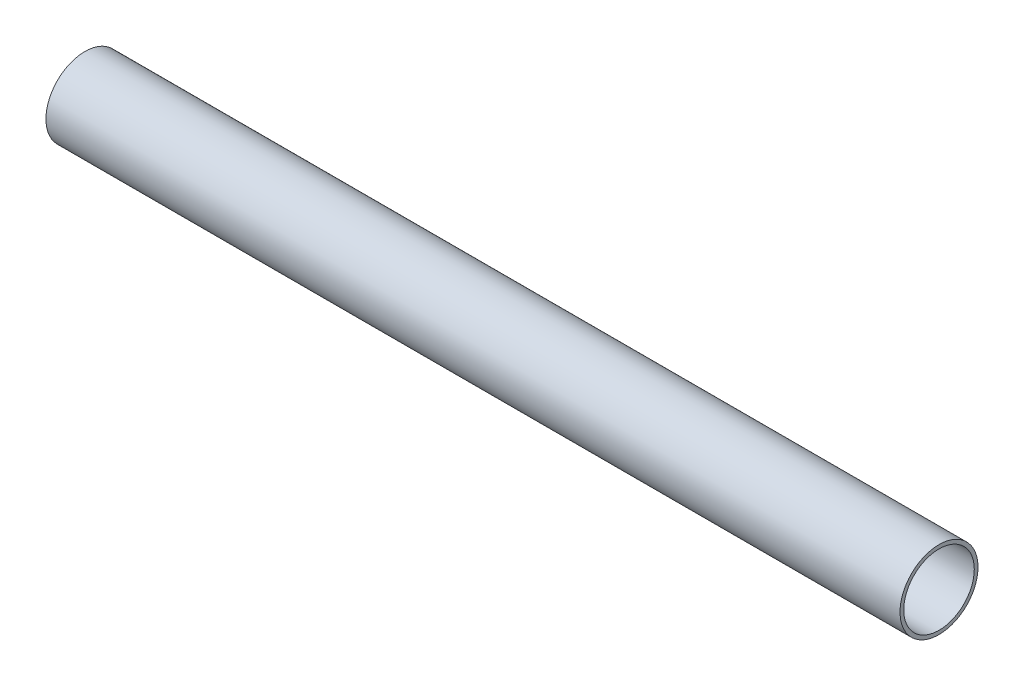
ISO-10303-21;
HEADER;
FILE_DESCRIPTION(('STEP AP214'),'2;1');
FILE_NAME('part.step','',(''),(''),'','','');
FILE_SCHEMA(('AUTOMOTIVE_DESIGN { 1 0 10303 214 1 1 1 1 }'));
ENDSEC;
DATA;
#1=APPLICATION_CONTEXT('core data for automotive mechanical design processes');
#2=APPLICATION_PROTOCOL_DEFINITION('international standard','automotive_design',2000,#1);
#3=PRODUCT_CONTEXT('',#1,'mechanical');
#4=PRODUCT('Part','Part','',(#3));
#5=PRODUCT_RELATED_PRODUCT_CATEGORY('part','',(#4));
#6=PRODUCT_DEFINITION_FORMATION('','',#4);
#7=PRODUCT_DEFINITION_CONTEXT('part definition',#1,'design');
#8=PRODUCT_DEFINITION('design','',#6,#7);
#9=PRODUCT_DEFINITION_SHAPE('','',#8);
#10=(LENGTH_UNIT() NAMED_UNIT(*) SI_UNIT(.MILLI.,.METRE.));
#11=(NAMED_UNIT(*) PLANE_ANGLE_UNIT() SI_UNIT($,.RADIAN.));
#12=(NAMED_UNIT(*) SI_UNIT($,.STERADIAN.) SOLID_ANGLE_UNIT());
#13=UNCERTAINTY_MEASURE_WITH_UNIT(LENGTH_MEASURE(1.E-05),#10,'distance_accuracy_value','');
#14=(GEOMETRIC_REPRESENTATION_CONTEXT(3) GLOBAL_UNCERTAINTY_ASSIGNED_CONTEXT((#13)) GLOBAL_UNIT_ASSIGNED_CONTEXT((#10,
#11,#12)) REPRESENTATION_CONTEXT('',''));
#15=CARTESIAN_POINT('',(0.,0.,0.));
#16=DIRECTION('',(0.,0.,1.));
#17=DIRECTION('',(1.,0.,0.));
#18=AXIS2_PLACEMENT_3D('',#15,#16,#17);
#19=CARTESIAN_POINT('',(230.,0.,0.));
#20=DIRECTION('',(1.,0.,0.));
#21=DIRECTION('',(0.,0.,-1.));
#22=AXIS2_PLACEMENT_3D('',#19,#20,#21);
#23=PLANE('',#22);
#24=CARTESIAN_POINT('',(230.,0.,0.));
#25=DIRECTION('',(1.,0.,0.));
#26=DIRECTION('',(0.,0.,-1.));
#27=AXIS2_PLACEMENT_3D('',#24,#25,#26);
#28=CIRCLE('',#27,10.5);
#29=CARTESIAN_POINT('',(230.,0.,-10.5));
#30=VERTEX_POINT('',#29);
#31=EDGE_CURVE('E10',#30,#30,#28,.T.);
#32=ORIENTED_EDGE('',*,*,#31,.T.);
#33=EDGE_LOOP('',(#32));
#34=FACE_BOUND('',#33,.T.);
#35=CARTESIAN_POINT('',(230.,0.,0.));
#36=DIRECTION('',(1.,0.,0.));
#37=DIRECTION('',(0.,0.,-1.));
#38=AXIS2_PLACEMENT_3D('',#35,#36,#37);
#39=CIRCLE('',#38,9.5);
#40=CARTESIAN_POINT('',(230.,0.,-9.5));
#41=VERTEX_POINT('',#40);
#42=EDGE_CURVE('E41',#41,#41,#39,.T.);
#43=ORIENTED_EDGE('',*,*,#42,.F.);
#44=EDGE_LOOP('',(#43));
#45=FACE_BOUND('',#44,.T.);
#46=ADVANCED_FACE('F30',(#34,#45),#23,.T.);
#47=CARTESIAN_POINT('',(0.,0.,0.));
#48=DIRECTION('',(1.,0.,0.));
#49=DIRECTION('',(0.,0.,-1.));
#50=AXIS2_PLACEMENT_3D('',#47,#48,#49);
#51=PLANE('',#50);
#52=CARTESIAN_POINT('',(0.,0.,0.));
#53=DIRECTION('',(1.,0.,0.));
#54=DIRECTION('',(0.,0.,-1.));
#55=AXIS2_PLACEMENT_3D('',#52,#53,#54);
#56=CIRCLE('',#55,10.5);
#57=CARTESIAN_POINT('',(0.,0.,-10.5));
#58=VERTEX_POINT('',#57);
#59=EDGE_CURVE('E34',#58,#58,#56,.T.);
#60=ORIENTED_EDGE('',*,*,#59,.F.);
#61=EDGE_LOOP('',(#60));
#62=FACE_BOUND('',#61,.T.);
#63=CARTESIAN_POINT('',(0.,0.,0.));
#64=DIRECTION('',(1.,0.,0.));
#65=DIRECTION('',(0.,0.,-1.));
#66=AXIS2_PLACEMENT_3D('',#63,#64,#65);
#67=CIRCLE('',#66,9.5);
#68=CARTESIAN_POINT('',(0.,0.,-9.5));
#69=VERTEX_POINT('',#68);
#70=EDGE_CURVE('E43',#69,#69,#67,.T.);
#71=ORIENTED_EDGE('',*,*,#70,.T.);
#72=EDGE_LOOP('',(#71));
#73=FACE_BOUND('',#72,.T.);
#74=ADVANCED_FACE('F53',(#62,#73),#51,.F.);
#75=CARTESIAN_POINT('',(230.,0.,0.));
#76=DIRECTION('',(-1.,0.,0.));
#77=DIRECTION('',(0.,0.,1.));
#78=AXIS2_PLACEMENT_3D('',#75,#76,#77);
#79=CYLINDRICAL_SURFACE('',#78,10.5);
#80=ORIENTED_EDGE('',*,*,#31,.F.);
#81=EDGE_LOOP('',(#80));
#82=FACE_BOUND('',#81,.T.);
#83=ORIENTED_EDGE('',*,*,#59,.T.);
#84=EDGE_LOOP('',(#83));
#85=FACE_BOUND('',#84,.T.);
#86=ADVANCED_FACE('F32',(#82,#85),#79,.T.);
#87=CARTESIAN_POINT('',(230.,0.,0.));
#88=DIRECTION('',(-1.,0.,0.));
#89=DIRECTION('',(0.,0.,1.));
#90=AXIS2_PLACEMENT_3D('',#87,#88,#89);
#91=CYLINDRICAL_SURFACE('',#90,9.5);
#92=ORIENTED_EDGE('',*,*,#42,.T.);
#93=EDGE_LOOP('',(#92));
#94=FACE_BOUND('',#93,.T.);
#95=ORIENTED_EDGE('',*,*,#70,.F.);
#96=EDGE_LOOP('',(#95));
#97=FACE_BOUND('',#96,.T.);
#98=ADVANCED_FACE('F49',(#94,#97),#91,.F.);
#99=CLOSED_SHELL('',(#46,#74,#86,#98));
#100=MANIFOLD_SOLID_BREP('B2',#99);
#101=ADVANCED_BREP_SHAPE_REPRESENTATION('',(#18,#100),#14);
#102=SHAPE_DEFINITION_REPRESENTATION(#9,#101);
ENDSEC;
END-ISO-10303-21;
